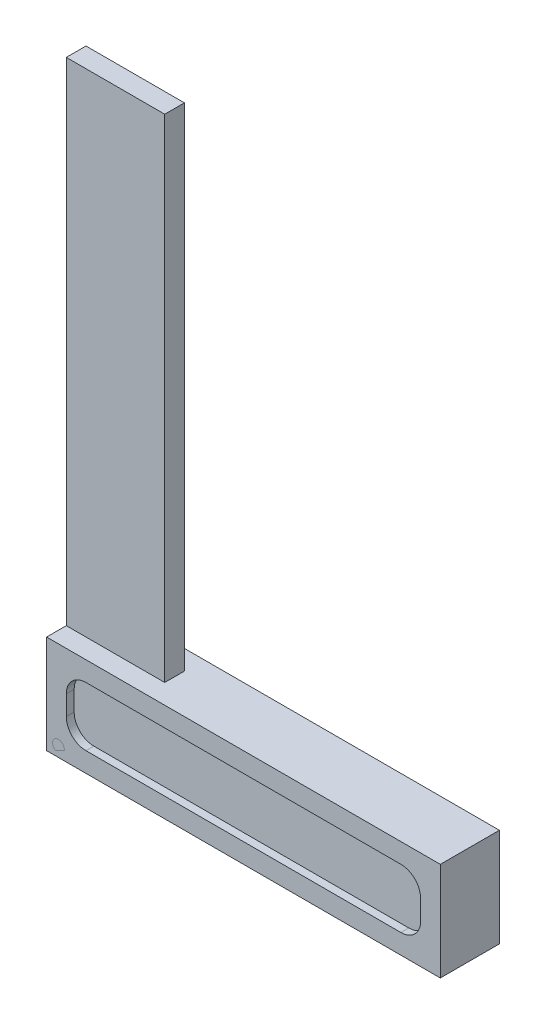
ISO-10303-21;
HEADER;
FILE_DESCRIPTION(('STEP AP214'),'2;1');
FILE_NAME('part.step','',(''),(''),'','','');
FILE_SCHEMA(('AUTOMOTIVE_DESIGN { 1 0 10303 214 1 1 1 1 }'));
ENDSEC;
DATA;
#1=APPLICATION_CONTEXT('core data for automotive mechanical design processes');
#2=APPLICATION_PROTOCOL_DEFINITION('international standard','automotive_design',2000,#1);
#3=PRODUCT_CONTEXT('',#1,'mechanical');
#4=PRODUCT('Part','Part','',(#3));
#5=PRODUCT_RELATED_PRODUCT_CATEGORY('part','',(#4));
#6=PRODUCT_DEFINITION_FORMATION('','',#4);
#7=PRODUCT_DEFINITION_CONTEXT('part definition',#1,'design');
#8=PRODUCT_DEFINITION('design','',#6,#7);
#9=PRODUCT_DEFINITION_SHAPE('','',#8);
#10=(LENGTH_UNIT() NAMED_UNIT(*) SI_UNIT(.MILLI.,.METRE.));
#11=(NAMED_UNIT(*) PLANE_ANGLE_UNIT() SI_UNIT($,.RADIAN.));
#12=(NAMED_UNIT(*) SI_UNIT($,.STERADIAN.) SOLID_ANGLE_UNIT());
#13=UNCERTAINTY_MEASURE_WITH_UNIT(LENGTH_MEASURE(1.E-05),#10,'distance_accuracy_value','');
#14=(GEOMETRIC_REPRESENTATION_CONTEXT(3) GLOBAL_UNCERTAINTY_ASSIGNED_CONTEXT((#13)) GLOBAL_UNIT_ASSIGNED_CONTEXT((#10,
#11,#12)) REPRESENTATION_CONTEXT('',''));
#15=CARTESIAN_POINT('',(0.,0.,0.));
#16=DIRECTION('',(0.,0.,1.));
#17=DIRECTION('',(1.,0.,0.));
#18=AXIS2_PLACEMENT_3D('',#15,#16,#17);
#19=CARTESIAN_POINT('',(3.,2.5,0.));
#20=DIRECTION('',(0.,0.,1.));
#21=DIRECTION('',(1.,0.,0.));
#22=AXIS2_PLACEMENT_3D('',#19,#20,#21);
#23=CYLINDRICAL_SURFACE('',#22,1.5);
#24=CARTESIAN_POINT('',(3.,2.5,0.));
#25=DIRECTION('',(0.,0.,1.));
#26=DIRECTION('',(1.,0.,0.));
#27=AXIS2_PLACEMENT_3D('',#24,#25,#26);
#28=CIRCLE('',#27,1.5);
#29=CARTESIAN_POINT('',(4.5,2.5,0.));
#30=VERTEX_POINT('',#29);
#31=EDGE_CURVE('E11',#30,#30,#28,.T.);
#32=ORIENTED_EDGE('',*,*,#31,.T.);
#33=EDGE_LOOP('',(#32));
#34=FACE_BOUND('',#33,.T.);
#35=CARTESIAN_POINT('',(3.,2.5,15.));
#36=DIRECTION('',(0.,0.,1.));
#37=DIRECTION('',(1.,0.,0.));
#38=AXIS2_PLACEMENT_3D('',#35,#36,#37);
#39=CIRCLE('',#38,1.5);
#40=CARTESIAN_POINT('',(4.5,2.5,15.));
#41=VERTEX_POINT('',#40);
#42=EDGE_CURVE('E43',#41,#41,#39,.T.);
#43=ORIENTED_EDGE('',*,*,#42,.F.);
#44=EDGE_LOOP('',(#43));
#45=FACE_BOUND('',#44,.T.);
#46=ADVANCED_FACE('F40',(#34,#45),#23,.T.);
#47=CARTESIAN_POINT('',(3.,2.5,0.));
#48=DIRECTION('',(0.,0.,1.));
#49=DIRECTION('',(1.,0.,0.));
#50=AXIS2_PLACEMENT_3D('',#47,#48,#49);
#51=PLANE('',#50);
#52=ORIENTED_EDGE('',*,*,#31,.F.);
#53=EDGE_LOOP('',(#52));
#54=FACE_BOUND('',#53,.T.);
#55=ADVANCED_FACE('F55',(#54),#51,.F.);
#56=CARTESIAN_POINT('',(3.,2.5,15.));
#57=DIRECTION('',(0.,0.,1.));
#58=DIRECTION('',(1.,0.,0.));
#59=AXIS2_PLACEMENT_3D('',#56,#57,#58);
#60=PLANE('',#59);
#61=ORIENTED_EDGE('',*,*,#42,.T.);
#62=EDGE_LOOP('',(#61));
#63=FACE_BOUND('',#62,.T.);
#64=ADVANCED_FACE('F52',(#63),#60,.T.);
#65=CLOSED_SHELL('',(#46,#55,#64));
#66=MANIFOLD_SOLID_BREP('B2',#65);
#67=CARTESIAN_POINT('',(22.5,22.5,0.));
#68=DIRECTION('',(0.,0.,1.));
#69=DIRECTION('',(1.,0.,0.));
#70=AXIS2_PLACEMENT_3D('',#67,#68,#69);
#71=CYLINDRICAL_SURFACE('',#70,1.5);
#72=CARTESIAN_POINT('',(22.5,22.5,0.));
#73=DIRECTION('',(0.,0.,1.));
#74=DIRECTION('',(1.,0.,0.));
#75=AXIS2_PLACEMENT_3D('',#72,#73,#74);
#76=CIRCLE('',#75,1.5);
#77=CARTESIAN_POINT('',(24.,22.5,0.));
#78=VERTEX_POINT('',#77);
#79=EDGE_CURVE('E39',#78,#78,#76,.T.);
#80=ORIENTED_EDGE('',*,*,#79,.T.);
#81=EDGE_LOOP('',(#80));
#82=FACE_BOUND('',#81,.T.);
#83=CARTESIAN_POINT('',(22.5,22.5,15.));
#84=DIRECTION('',(0.,0.,1.));
#85=DIRECTION('',(1.,0.,0.));
#86=AXIS2_PLACEMENT_3D('',#83,#84,#85);
#87=CIRCLE('',#86,1.5);
#88=CARTESIAN_POINT('',(24.,22.5,15.));
#89=VERTEX_POINT('',#88);
#90=EDGE_CURVE('E94',#89,#89,#87,.T.);
#91=ORIENTED_EDGE('',*,*,#90,.F.);
#92=EDGE_LOOP('',(#91));
#93=FACE_BOUND('',#92,.T.);
#94=ADVANCED_FACE('F91',(#82,#93),#71,.T.);
#95=CARTESIAN_POINT('',(22.5,22.5,0.));
#96=DIRECTION('',(0.,0.,1.));
#97=DIRECTION('',(1.,0.,0.));
#98=AXIS2_PLACEMENT_3D('',#95,#96,#97);
#99=PLANE('',#98);
#100=ORIENTED_EDGE('',*,*,#79,.F.);
#101=EDGE_LOOP('',(#100));
#102=FACE_BOUND('',#101,.T.);
#103=ADVANCED_FACE('F106',(#102),#99,.F.);
#104=CARTESIAN_POINT('',(22.5,22.5,15.));
#105=DIRECTION('',(0.,0.,1.));
#106=DIRECTION('',(1.,0.,0.));
#107=AXIS2_PLACEMENT_3D('',#104,#105,#106);
#108=PLANE('',#107);
#109=ORIENTED_EDGE('',*,*,#90,.T.);
#110=EDGE_LOOP('',(#109));
#111=FACE_BOUND('',#110,.T.);
#112=ADVANCED_FACE('F103',(#111),#108,.T.);
#113=CLOSED_SHELL('',(#94,#103,#112));
#114=MANIFOLD_SOLID_BREP('B6',#113);
#115=CARTESIAN_POINT('',(25.,25.,5.));
#116=DIRECTION('',(0.,0.,-1.));
#117=DIRECTION('',(-1.,0.,0.));
#118=AXIS2_PLACEMENT_3D('',#115,#116,#117);
#119=PLANE('',#118);
#120=DIRECTION('',(0.,-1.,0.));
#121=VECTOR('',#120,1.);
#122=CARTESIAN_POINT('',(0.,25.,5.));
#123=LINE('',#122,#121);
#124=CARTESIAN_POINT('',(0.,150.,5.));
#125=VERTEX_POINT('',#124);
#126=CARTESIAN_POINT('',(0.,0.,5.));
#127=VERTEX_POINT('',#126);
#128=EDGE_CURVE('E201',#125,#127,#123,.T.);
#129=ORIENTED_EDGE('',*,*,#128,.F.);
#130=DIRECTION('',(-1.,0.,0.));
#131=VECTOR('',#130,1.);
#132=CARTESIAN_POINT('',(25.,150.,5.));
#133=LINE('',#132,#131);
#134=CARTESIAN_POINT('',(25.,150.,5.));
#135=VERTEX_POINT('',#134);
#136=EDGE_CURVE('E89',#135,#125,#133,.T.);
#137=ORIENTED_EDGE('',*,*,#136,.F.);
#138=DIRECTION('',(0.,-1.,0.));
#139=VECTOR('',#138,1.);
#140=CARTESIAN_POINT('',(25.,0.,5.));
#141=LINE('',#140,#139);
#142=CARTESIAN_POINT('',(25.,0.,5.));
#143=VERTEX_POINT('',#142);
#144=EDGE_CURVE('E160',#135,#143,#141,.T.);
#145=ORIENTED_EDGE('',*,*,#144,.T.);
#146=DIRECTION('',(-1.,0.,0.));
#147=VECTOR('',#146,1.);
#148=CARTESIAN_POINT('',(25.,0.,5.));
#149=LINE('',#148,#147);
#150=EDGE_CURVE('E145',#143,#127,#149,.T.);
#151=ORIENTED_EDGE('',*,*,#150,.T.);
#152=EDGE_LOOP('',(#129,#137,#145,#151));
#153=FACE_BOUND('',#152,.T.);
#154=ADVANCED_FACE('F141',(#153),#119,.T.);
#155=CARTESIAN_POINT('',(25.,150.,5.));
#156=DIRECTION('',(0.,1.,0.));
#157=DIRECTION('',(0.,0.,1.));
#158=AXIS2_PLACEMENT_3D('',#155,#156,#157);
#159=PLANE('',#158);
#160=DIRECTION('',(0.,0.,-1.));
#161=VECTOR('',#160,1.);
#162=CARTESIAN_POINT('',(0.,150.,5.));
#163=LINE('',#162,#161);
#164=CARTESIAN_POINT('',(0.,150.,10.));
#165=VERTEX_POINT('',#164);
#166=EDGE_CURVE('E208',#165,#125,#163,.T.);
#167=ORIENTED_EDGE('',*,*,#166,.F.);
#168=DIRECTION('',(-1.,0.,0.));
#169=VECTOR('',#168,1.);
#170=CARTESIAN_POINT('',(25.,150.,10.));
#171=LINE('',#170,#169);
#172=CARTESIAN_POINT('',(25.,150.,10.));
#173=VERTEX_POINT('',#172);
#174=EDGE_CURVE('E151',#173,#165,#171,.T.);
#175=ORIENTED_EDGE('',*,*,#174,.F.);
#176=DIRECTION('',(0.,0.,-1.));
#177=VECTOR('',#176,1.);
#178=CARTESIAN_POINT('',(25.,150.,5.));
#179=LINE('',#178,#177);
#180=EDGE_CURVE('E198',#173,#135,#179,.T.);
#181=ORIENTED_EDGE('',*,*,#180,.T.);
#182=ORIENTED_EDGE('',*,*,#136,.T.);
#183=EDGE_LOOP('',(#167,#175,#181,#182));
#184=FACE_BOUND('',#183,.T.);
#185=ADVANCED_FACE('F215',(#184),#159,.T.);
#186=CARTESIAN_POINT('',(25.,150.,10.));
#187=DIRECTION('',(0.,0.,1.));
#188=DIRECTION('',(1.,0.,0.));
#189=AXIS2_PLACEMENT_3D('',#186,#187,#188);
#190=PLANE('',#189);
#191=DIRECTION('',(0.,1.,0.));
#192=VECTOR('',#191,1.);
#193=CARTESIAN_POINT('',(0.,150.,10.));
#194=LINE('',#193,#192);
#195=CARTESIAN_POINT('',(0.,0.,10.));
#196=VERTEX_POINT('',#195);
#197=EDGE_CURVE('E194',#196,#165,#194,.T.);
#198=ORIENTED_EDGE('',*,*,#197,.F.);
#199=DIRECTION('',(-1.,0.,0.));
#200=VECTOR('',#199,1.);
#201=CARTESIAN_POINT('',(25.,0.,10.));
#202=LINE('',#201,#200);
#203=CARTESIAN_POINT('',(25.,0.,10.));
#204=VERTEX_POINT('',#203);
#205=EDGE_CURVE('E189',#204,#196,#202,.T.);
#206=ORIENTED_EDGE('',*,*,#205,.F.);
#207=DIRECTION('',(0.,1.,0.));
#208=VECTOR('',#207,1.);
#209=CARTESIAN_POINT('',(25.,0.,10.));
#210=LINE('',#209,#208);
#211=EDGE_CURVE('E192',#204,#173,#210,.T.);
#212=ORIENTED_EDGE('',*,*,#211,.T.);
#213=ORIENTED_EDGE('',*,*,#174,.T.);
#214=EDGE_LOOP('',(#198,#206,#212,#213));
#215=FACE_BOUND('',#214,.T.);
#216=ADVANCED_FACE('F191',(#215),#190,.T.);
#217=CARTESIAN_POINT('',(25.,0.,5.));
#218=DIRECTION('',(0.,-1.,0.));
#219=DIRECTION('',(0.,0.,-1.));
#220=AXIS2_PLACEMENT_3D('',#217,#218,#219);
#221=PLANE('',#220);
#222=DIRECTION('',(0.,0.,1.));
#223=VECTOR('',#222,1.);
#224=CARTESIAN_POINT('',(0.,0.,5.));
#225=LINE('',#224,#223);
#226=EDGE_CURVE('E205',#127,#196,#225,.T.);
#227=ORIENTED_EDGE('',*,*,#226,.F.);
#228=ORIENTED_EDGE('',*,*,#150,.F.);
#229=DIRECTION('',(0.,0.,1.));
#230=VECTOR('',#229,1.);
#231=CARTESIAN_POINT('',(25.,0.,5.));
#232=LINE('',#231,#230);
#233=EDGE_CURVE('E197',#143,#204,#232,.T.);
#234=ORIENTED_EDGE('',*,*,#233,.T.);
#235=ORIENTED_EDGE('',*,*,#205,.T.);
#236=EDGE_LOOP('',(#227,#228,#234,#235));
#237=FACE_BOUND('',#236,.T.);
#238=ADVANCED_FACE('F143',(#237),#221,.T.);
#239=CARTESIAN_POINT('',(25.,0.,0.));
#240=DIRECTION('',(1.,0.,0.));
#241=DIRECTION('',(0.,0.,-1.));
#242=AXIS2_PLACEMENT_3D('',#239,#240,#241);
#243=PLANE('',#242);
#244=ORIENTED_EDGE('',*,*,#144,.F.);
#245=ORIENTED_EDGE('',*,*,#180,.F.);
#246=ORIENTED_EDGE('',*,*,#211,.F.);
#247=ORIENTED_EDGE('',*,*,#233,.F.);
#248=EDGE_LOOP('',(#244,#245,#246,#247));
#249=FACE_BOUND('',#248,.T.);
#250=ADVANCED_FACE('F196',(#249),#243,.T.);
#251=CARTESIAN_POINT('',(0.,0.,0.));
#252=DIRECTION('',(1.,0.,0.));
#253=DIRECTION('',(0.,0.,-1.));
#254=AXIS2_PLACEMENT_3D('',#251,#252,#253);
#255=PLANE('',#254);
#256=ORIENTED_EDGE('',*,*,#128,.T.);
#257=ORIENTED_EDGE('',*,*,#226,.T.);
#258=ORIENTED_EDGE('',*,*,#197,.T.);
#259=ORIENTED_EDGE('',*,*,#166,.T.);
#260=EDGE_LOOP('',(#256,#257,#258,#259));
#261=FACE_BOUND('',#260,.T.);
#262=ADVANCED_FACE('F213',(#261),#255,.F.);
#263=CLOSED_SHELL('',(#154,#185,#216,#238,#250,#262));
#264=MANIFOLD_SOLID_BREP('B34',#263);
#265=CARTESIAN_POINT('',(0.,0.,15.));
#266=DIRECTION('',(1.,0.,0.));
#267=DIRECTION('',(0.,0.,-1.));
#268=AXIS2_PLACEMENT_3D('',#265,#266,#267);
#269=PLANE('',#268);
#270=DIRECTION('',(0.,-1.,0.));
#271=VECTOR('',#270,1.);
#272=CARTESIAN_POINT('',(0.,0.,0.));
#273=LINE('',#272,#271);
#274=CARTESIAN_POINT('',(0.,25.,0.));
#275=VERTEX_POINT('',#274);
#276=CARTESIAN_POINT('',(0.,0.,0.));
#277=VERTEX_POINT('',#276);
#278=EDGE_CURVE('E382',#275,#277,#273,.T.);
#279=ORIENTED_EDGE('',*,*,#278,.T.);
#280=DIRECTION('',(0.,0.,-1.));
#281=VECTOR('',#280,1.);
#282=CARTESIAN_POINT('',(0.,0.,15.));
#283=LINE('',#282,#281);
#284=CARTESIAN_POINT('',(0.,0.,15.));
#285=VERTEX_POINT('',#284);
#286=EDGE_CURVE('E363',#285,#277,#283,.T.);
#287=ORIENTED_EDGE('',*,*,#286,.F.);
#288=DIRECTION('',(0.,-1.,0.));
#289=VECTOR('',#288,1.);
#290=CARTESIAN_POINT('',(0.,0.,15.));
#291=LINE('',#290,#289);
#292=CARTESIAN_POINT('',(0.,25.,15.));
#293=VERTEX_POINT('',#292);
#294=EDGE_CURVE('E370',#293,#285,#291,.T.);
#295=ORIENTED_EDGE('',*,*,#294,.F.);
#296=DIRECTION('',(0.,0.,-1.));
#297=VECTOR('',#296,1.);
#298=CARTESIAN_POINT('',(0.,25.,15.));
#299=LINE('',#298,#297);
#300=EDGE_CURVE('E460',#293,#275,#299,.T.);
#301=ORIENTED_EDGE('',*,*,#300,.T.);
#302=EDGE_LOOP('',(#279,#287,#295,#301));
#303=FACE_BOUND('',#302,.T.);
#304=ADVANCED_FACE('F271',(#303),#269,.F.);
#305=CARTESIAN_POINT('',(0.,0.,15.));
#306=DIRECTION('',(0.,1.,0.));
#307=DIRECTION('',(0.,0.,1.));
#308=AXIS2_PLACEMENT_3D('',#305,#306,#307);
#309=PLANE('',#308);
#310=DIRECTION('',(1.,0.,0.));
#311=VECTOR('',#310,1.);
#312=CARTESIAN_POINT('',(0.,0.,0.));
#313=LINE('',#312,#311);
#314=CARTESIAN_POINT('',(100.,0.,0.));
#315=VERTEX_POINT('',#314);
#316=EDGE_CURVE('E447',#277,#315,#313,.T.);
#317=ORIENTED_EDGE('',*,*,#316,.T.);
#318=DIRECTION('',(0.,0.,-1.));
#319=VECTOR('',#318,1.);
#320=CARTESIAN_POINT('',(100.,0.,15.));
#321=LINE('',#320,#319);
#322=CARTESIAN_POINT('',(100.,0.,15.));
#323=VERTEX_POINT('',#322);
#324=EDGE_CURVE('E366',#323,#315,#321,.T.);
#325=ORIENTED_EDGE('',*,*,#324,.F.);
#326=DIRECTION('',(1.,0.,0.));
#327=VECTOR('',#326,1.);
#328=CARTESIAN_POINT('',(0.,0.,15.));
#329=LINE('',#328,#327);
#330=EDGE_CURVE('E359',#285,#323,#329,.T.);
#331=ORIENTED_EDGE('',*,*,#330,.F.);
#332=ORIENTED_EDGE('',*,*,#286,.T.);
#333=EDGE_LOOP('',(#317,#325,#331,#332));
#334=FACE_BOUND('',#333,.T.);
#335=ADVANCED_FACE('F361',(#334),#309,.F.);
#336=CARTESIAN_POINT('',(100.,0.,15.));
#337=DIRECTION('',(-1.,0.,0.));
#338=DIRECTION('',(0.,0.,1.));
#339=AXIS2_PLACEMENT_3D('',#336,#337,#338);
#340=PLANE('',#339);
#341=DIRECTION('',(0.,1.,0.));
#342=VECTOR('',#341,1.);
#343=CARTESIAN_POINT('',(100.,0.,0.));
#344=LINE('',#343,#342);
#345=CARTESIAN_POINT('',(100.,25.,0.));
#346=VERTEX_POINT('',#345);
#347=EDGE_CURVE('E463',#315,#346,#344,.T.);
#348=ORIENTED_EDGE('',*,*,#347,.T.);
#349=DIRECTION('',(0.,0.,-1.));
#350=VECTOR('',#349,1.);
#351=CARTESIAN_POINT('',(100.,25.,15.));
#352=LINE('',#351,#350);
#353=CARTESIAN_POINT('',(100.,25.,15.));
#354=VERTEX_POINT('',#353);
#355=EDGE_CURVE('E387',#354,#346,#352,.T.);
#356=ORIENTED_EDGE('',*,*,#355,.F.);
#357=DIRECTION('',(0.,1.,0.));
#358=VECTOR('',#357,1.);
#359=CARTESIAN_POINT('',(100.,0.,15.));
#360=LINE('',#359,#358);
#361=EDGE_CURVE('E369',#323,#354,#360,.T.);
#362=ORIENTED_EDGE('',*,*,#361,.F.);
#363=ORIENTED_EDGE('',*,*,#324,.T.);
#364=EDGE_LOOP('',(#348,#356,#362,#363));
#365=FACE_BOUND('',#364,.T.);
#366=ADVANCED_FACE('F475',(#365),#340,.F.);
#367=CARTESIAN_POINT('',(0.,25.,15.));
#368=DIRECTION('',(0.,-1.,0.));
#369=DIRECTION('',(0.,0.,-1.));
#370=AXIS2_PLACEMENT_3D('',#367,#368,#369);
#371=PLANE('',#370);
#372=DIRECTION('',(-1.,0.,0.));
#373=VECTOR('',#372,1.);
#374=CARTESIAN_POINT('',(0.,25.,0.));
#375=LINE('',#374,#373);
#376=EDGE_CURVE('E379',#346,#275,#375,.T.);
#377=ORIENTED_EDGE('',*,*,#376,.T.);
#378=ORIENTED_EDGE('',*,*,#300,.F.);
#379=DIRECTION('',(-1.,0.,0.));
#380=VECTOR('',#379,1.);
#381=CARTESIAN_POINT('',(0.,25.,15.));
#382=LINE('',#381,#380);
#383=EDGE_CURVE('E375',#354,#293,#382,.T.);
#384=ORIENTED_EDGE('',*,*,#383,.F.);
#385=ORIENTED_EDGE('',*,*,#355,.T.);
#386=EDGE_LOOP('',(#377,#378,#384,#385));
#387=FACE_BOUND('',#386,.T.);
#388=ADVANCED_FACE('F470',(#387),#371,.F.);
#389=CARTESIAN_POINT('',(0.,0.,15.));
#390=DIRECTION('',(0.,0.,-1.));
#391=DIRECTION('',(-1.,0.,0.));
#392=AXIS2_PLACEMENT_3D('',#389,#390,#391);
#393=PLANE('',#392);
#394=DIRECTION('',(1.,0.,0.));
#395=VECTOR('',#394,1.);
#396=CARTESIAN_POINT('',(5.,5.,15.));
#397=LINE('',#396,#395);
#398=CARTESIAN_POINT('',(10.,5.,15.));
#399=VERTEX_POINT('',#398);
#400=CARTESIAN_POINT('',(90.,5.,15.));
#401=VERTEX_POINT('',#400);
#402=EDGE_CURVE('E432',#399,#401,#397,.T.);
#403=ORIENTED_EDGE('',*,*,#402,.F.);
#404=CARTESIAN_POINT('',(10.,10.,15.));
#405=DIRECTION('',(0.,0.,-1.));
#406=DIRECTION('',(-1.,0.,0.));
#407=AXIS2_PLACEMENT_3D('',#404,#405,#406);
#408=CIRCLE('',#407,5.);
#409=CARTESIAN_POINT('',(5.,10.,15.));
#410=VERTEX_POINT('',#409);
#411=EDGE_CURVE('E279',#399,#410,#408,.T.);
#412=ORIENTED_EDGE('',*,*,#411,.T.);
#413=DIRECTION('',(0.,-1.,0.));
#414=VECTOR('',#413,1.);
#415=CARTESIAN_POINT('',(5.,20.,15.));
#416=LINE('',#415,#414);
#417=CARTESIAN_POINT('',(5.,15.,15.));
#418=VERTEX_POINT('',#417);
#419=EDGE_CURVE('E453',#418,#410,#416,.T.);
#420=ORIENTED_EDGE('',*,*,#419,.F.);
#421=CARTESIAN_POINT('',(10.,15.,15.));
#422=DIRECTION('',(0.,0.,-1.));
#423=DIRECTION('',(-1.,0.,0.));
#424=AXIS2_PLACEMENT_3D('',#421,#422,#423);
#425=CIRCLE('',#424,5.);
#426=CARTESIAN_POINT('',(10.,20.,15.));
#427=VERTEX_POINT('',#426);
#428=EDGE_CURVE('E139',#418,#427,#425,.T.);
#429=ORIENTED_EDGE('',*,*,#428,.T.);
#430=DIRECTION('',(-1.,0.,0.));
#431=VECTOR('',#430,1.);
#432=CARTESIAN_POINT('',(5.,20.,15.));
#433=LINE('',#432,#431);
#434=CARTESIAN_POINT('',(90.,20.,15.));
#435=VERTEX_POINT('',#434);
#436=EDGE_CURVE('E423',#435,#427,#433,.T.);
#437=ORIENTED_EDGE('',*,*,#436,.F.);
#438=CARTESIAN_POINT('',(90.,15.,15.));
#439=DIRECTION('',(0.,0.,-1.));
#440=DIRECTION('',(-1.,0.,0.));
#441=AXIS2_PLACEMENT_3D('',#438,#439,#440);
#442=CIRCLE('',#441,5.);
#443=CARTESIAN_POINT('',(95.,15.,15.));
#444=VERTEX_POINT('',#443);
#445=EDGE_CURVE('E417',#435,#444,#442,.T.);
#446=ORIENTED_EDGE('',*,*,#445,.T.);
#447=DIRECTION('',(0.,1.,0.));
#448=VECTOR('',#447,1.);
#449=CARTESIAN_POINT('',(95.,20.,15.));
#450=LINE('',#449,#448);
#451=CARTESIAN_POINT('',(95.,10.,15.));
#452=VERTEX_POINT('',#451);
#453=EDGE_CURVE('E421',#452,#444,#450,.T.);
#454=ORIENTED_EDGE('',*,*,#453,.F.);
#455=CARTESIAN_POINT('',(90.,10.,15.));
#456=DIRECTION('',(0.,0.,-1.));
#457=DIRECTION('',(-1.,0.,0.));
#458=AXIS2_PLACEMENT_3D('',#455,#456,#457);
#459=CIRCLE('',#458,5.);
#460=EDGE_CURVE('E415',#452,#401,#459,.T.);
#461=ORIENTED_EDGE('',*,*,#460,.T.);
#462=EDGE_LOOP('',(#403,#412,#420,#429,#437,#446,#454,#461));
#463=FACE_BOUND('',#462,.T.);
#464=ORIENTED_EDGE('',*,*,#294,.T.);
#465=ORIENTED_EDGE('',*,*,#330,.T.);
#466=ORIENTED_EDGE('',*,*,#361,.T.);
#467=ORIENTED_EDGE('',*,*,#383,.T.);
#468=EDGE_LOOP('',(#464,#465,#466,#467));
#469=FACE_BOUND('',#468,.T.);
#470=ADVANCED_FACE('F373',(#463,#469),#393,.F.);
#471=CARTESIAN_POINT('',(0.,0.,0.));
#472=DIRECTION('',(0.,0.,-1.));
#473=DIRECTION('',(-1.,0.,0.));
#474=AXIS2_PLACEMENT_3D('',#471,#472,#473);
#475=PLANE('',#474);
#476=ORIENTED_EDGE('',*,*,#278,.F.);
#477=ORIENTED_EDGE('',*,*,#376,.F.);
#478=ORIENTED_EDGE('',*,*,#347,.F.);
#479=ORIENTED_EDGE('',*,*,#316,.F.);
#480=EDGE_LOOP('',(#476,#477,#478,#479));
#481=FACE_BOUND('',#480,.T.);
#482=ADVANCED_FACE('F474',(#481),#475,.T.);
#483=CARTESIAN_POINT('',(5.,20.,13.));
#484=DIRECTION('',(-1.,0.,0.));
#485=DIRECTION('',(0.,0.,1.));
#486=AXIS2_PLACEMENT_3D('',#483,#484,#485);
#487=PLANE('',#486);
#488=ORIENTED_EDGE('',*,*,#419,.T.);
#489=DIRECTION('',(0.,0.,1.));
#490=VECTOR('',#489,1.);
#491=CARTESIAN_POINT('',(5.,10.,13.));
#492=LINE('',#491,#490);
#493=CARTESIAN_POINT('',(5.,10.,13.));
#494=VERTEX_POINT('',#493);
#495=EDGE_CURVE('E413',#410,#494,#492,.F.);
#496=ORIENTED_EDGE('',*,*,#495,.T.);
#497=DIRECTION('',(0.,-1.,0.));
#498=VECTOR('',#497,1.);
#499=CARTESIAN_POINT('',(5.,20.,13.));
#500=LINE('',#499,#498);
#501=CARTESIAN_POINT('',(5.,15.,13.));
#502=VERTEX_POINT('',#501);
#503=EDGE_CURVE('E457',#502,#494,#500,.T.);
#504=ORIENTED_EDGE('',*,*,#503,.F.);
#505=DIRECTION('',(0.,0.,1.));
#506=VECTOR('',#505,1.);
#507=CARTESIAN_POINT('',(5.,15.,15.));
#508=LINE('',#507,#506);
#509=EDGE_CURVE('E411',#502,#418,#508,.T.);
#510=ORIENTED_EDGE('',*,*,#509,.T.);
#511=EDGE_LOOP('',(#488,#496,#504,#510));
#512=FACE_BOUND('',#511,.T.);
#513=ADVANCED_FACE('F521',(#512),#487,.F.);
#514=CARTESIAN_POINT('',(5.,20.,13.));
#515=DIRECTION('',(0.,1.,0.));
#516=DIRECTION('',(0.,0.,1.));
#517=AXIS2_PLACEMENT_3D('',#514,#515,#516);
#518=PLANE('',#517);
#519=DIRECTION('',(-1.,0.,0.));
#520=VECTOR('',#519,1.);
#521=CARTESIAN_POINT('',(5.,20.,13.));
#522=LINE('',#521,#520);
#523=CARTESIAN_POINT('',(90.,20.,13.));
#524=VERTEX_POINT('',#523);
#525=CARTESIAN_POINT('',(10.,20.,13.));
#526=VERTEX_POINT('',#525);
#527=EDGE_CURVE('E441',#524,#526,#522,.T.);
#528=ORIENTED_EDGE('',*,*,#527,.F.);
#529=DIRECTION('',(0.,0.,1.));
#530=VECTOR('',#529,1.);
#531=CARTESIAN_POINT('',(90.,20.,15.));
#532=LINE('',#531,#530);
#533=EDGE_CURVE('E408',#524,#435,#532,.T.);
#534=ORIENTED_EDGE('',*,*,#533,.T.);
#535=ORIENTED_EDGE('',*,*,#436,.T.);
#536=DIRECTION('',(0.,0.,1.));
#537=VECTOR('',#536,1.);
#538=CARTESIAN_POINT('',(10.,20.,13.));
#539=LINE('',#538,#537);
#540=EDGE_CURVE('E406',#427,#526,#539,.F.);
#541=ORIENTED_EDGE('',*,*,#540,.T.);
#542=EDGE_LOOP('',(#528,#534,#535,#541));
#543=FACE_BOUND('',#542,.T.);
#544=ADVANCED_FACE('F445',(#543),#518,.F.);
#545=CARTESIAN_POINT('',(95.,20.,13.));
#546=DIRECTION('',(1.,0.,0.));
#547=DIRECTION('',(0.,0.,-1.));
#548=AXIS2_PLACEMENT_3D('',#545,#546,#547);
#549=PLANE('',#548);
#550=DIRECTION('',(0.,1.,0.));
#551=VECTOR('',#550,1.);
#552=CARTESIAN_POINT('',(95.,20.,13.));
#553=LINE('',#552,#551);
#554=CARTESIAN_POINT('',(95.,10.,13.));
#555=VERTEX_POINT('',#554);
#556=CARTESIAN_POINT('',(95.,15.,13.));
#557=VERTEX_POINT('',#556);
#558=EDGE_CURVE('E443',#555,#557,#553,.T.);
#559=ORIENTED_EDGE('',*,*,#558,.F.);
#560=DIRECTION('',(0.,0.,1.));
#561=VECTOR('',#560,1.);
#562=CARTESIAN_POINT('',(95.,10.,15.));
#563=LINE('',#562,#561);
#564=EDGE_CURVE('E385',#555,#452,#563,.T.);
#565=ORIENTED_EDGE('',*,*,#564,.T.);
#566=ORIENTED_EDGE('',*,*,#453,.T.);
#567=DIRECTION('',(0.,0.,1.));
#568=VECTOR('',#567,1.);
#569=CARTESIAN_POINT('',(95.,15.,13.));
#570=LINE('',#569,#568);
#571=EDGE_CURVE('E383',#444,#557,#570,.F.);
#572=ORIENTED_EDGE('',*,*,#571,.T.);
#573=EDGE_LOOP('',(#559,#565,#566,#572));
#574=FACE_BOUND('',#573,.T.);
#575=ADVANCED_FACE('F429',(#574),#549,.F.);
#576=CARTESIAN_POINT('',(5.,5.,13.));
#577=DIRECTION('',(0.,-1.,0.));
#578=DIRECTION('',(0.,0.,-1.));
#579=AXIS2_PLACEMENT_3D('',#576,#577,#578);
#580=PLANE('',#579);
#581=ORIENTED_EDGE('',*,*,#402,.T.);
#582=DIRECTION('',(0.,0.,1.));
#583=VECTOR('',#582,1.);
#584=CARTESIAN_POINT('',(90.,5.,13.));
#585=LINE('',#584,#583);
#586=CARTESIAN_POINT('',(90.,5.,13.));
#587=VERTEX_POINT('',#586);
#588=EDGE_CURVE('E396',#401,#587,#585,.F.);
#589=ORIENTED_EDGE('',*,*,#588,.T.);
#590=DIRECTION('',(1.,0.,0.));
#591=VECTOR('',#590,1.);
#592=CARTESIAN_POINT('',(5.,5.,13.));
#593=LINE('',#592,#591);
#594=CARTESIAN_POINT('',(10.,5.,13.));
#595=VERTEX_POINT('',#594);
#596=EDGE_CURVE('E449',#595,#587,#593,.T.);
#597=ORIENTED_EDGE('',*,*,#596,.F.);
#598=DIRECTION('',(0.,0.,1.));
#599=VECTOR('',#598,1.);
#600=CARTESIAN_POINT('',(10.,5.,15.));
#601=LINE('',#600,#599);
#602=EDGE_CURVE('E393',#595,#399,#601,.T.);
#603=ORIENTED_EDGE('',*,*,#602,.T.);
#604=EDGE_LOOP('',(#581,#589,#597,#603));
#605=FACE_BOUND('',#604,.T.);
#606=ADVANCED_FACE('F508',(#605),#580,.F.);
#607=CARTESIAN_POINT('',(0.,0.,13.));
#608=DIRECTION('',(0.,0.,1.));
#609=DIRECTION('',(1.,0.,0.));
#610=AXIS2_PLACEMENT_3D('',#607,#608,#609);
#611=PLANE('',#610);
#612=ORIENTED_EDGE('',*,*,#596,.T.);
#613=CARTESIAN_POINT('',(90.,10.,13.));
#614=DIRECTION('',(0.,0.,1.));
#615=DIRECTION('',(1.,0.,0.));
#616=AXIS2_PLACEMENT_3D('',#613,#614,#615);
#617=CIRCLE('',#616,5.);
#618=EDGE_CURVE('E404',#587,#555,#617,.T.);
#619=ORIENTED_EDGE('',*,*,#618,.T.);
#620=ORIENTED_EDGE('',*,*,#558,.T.);
#621=CARTESIAN_POINT('',(90.,15.,13.));
#622=DIRECTION('',(0.,0.,1.));
#623=DIRECTION('',(1.,0.,0.));
#624=AXIS2_PLACEMENT_3D('',#621,#622,#623);
#625=CIRCLE('',#624,5.);
#626=EDGE_CURVE('E402',#557,#524,#625,.T.);
#627=ORIENTED_EDGE('',*,*,#626,.T.);
#628=ORIENTED_EDGE('',*,*,#527,.T.);
#629=CARTESIAN_POINT('',(10.,15.,13.));
#630=DIRECTION('',(0.,0.,1.));
#631=DIRECTION('',(1.,0.,0.));
#632=AXIS2_PLACEMENT_3D('',#629,#630,#631);
#633=CIRCLE('',#632,5.);
#634=EDGE_CURVE('E398',#526,#502,#633,.T.);
#635=ORIENTED_EDGE('',*,*,#634,.T.);
#636=ORIENTED_EDGE('',*,*,#503,.T.);
#637=CARTESIAN_POINT('',(10.,10.,13.));
#638=DIRECTION('',(0.,0.,1.));
#639=DIRECTION('',(1.,0.,0.));
#640=AXIS2_PLACEMENT_3D('',#637,#638,#639);
#641=CIRCLE('',#640,5.);
#642=EDGE_CURVE('E400',#494,#595,#641,.T.);
#643=ORIENTED_EDGE('',*,*,#642,.T.);
#644=EDGE_LOOP('',(#612,#619,#620,#627,#628,#635,#636,#643));
#645=FACE_BOUND('',#644,.T.);
#646=ADVANCED_FACE('F440',(#645),#611,.T.);
#647=CARTESIAN_POINT('',(90.,10.,13.));
#648=DIRECTION('',(0.,0.,-1.));
#649=DIRECTION('',(-1.,0.,0.));
#650=AXIS2_PLACEMENT_3D('',#647,#648,#649);
#651=CYLINDRICAL_SURFACE('',#650,5.);
#652=ORIENTED_EDGE('',*,*,#618,.F.);
#653=ORIENTED_EDGE('',*,*,#588,.F.);
#654=ORIENTED_EDGE('',*,*,#460,.F.);
#655=ORIENTED_EDGE('',*,*,#564,.F.);
#656=EDGE_LOOP('',(#652,#653,#654,#655));
#657=FACE_BOUND('',#656,.T.);
#658=ADVANCED_FACE('F489',(#657),#651,.F.);
#659=CARTESIAN_POINT('',(90.,15.,13.));
#660=DIRECTION('',(0.,0.,-1.));
#661=DIRECTION('',(-1.,0.,0.));
#662=AXIS2_PLACEMENT_3D('',#659,#660,#661);
#663=CYLINDRICAL_SURFACE('',#662,5.);
#664=ORIENTED_EDGE('',*,*,#626,.F.);
#665=ORIENTED_EDGE('',*,*,#571,.F.);
#666=ORIENTED_EDGE('',*,*,#445,.F.);
#667=ORIENTED_EDGE('',*,*,#533,.F.);
#668=EDGE_LOOP('',(#664,#665,#666,#667));
#669=FACE_BOUND('',#668,.T.);
#670=ADVANCED_FACE('F435',(#669),#663,.F.);
#671=CARTESIAN_POINT('',(10.,10.,13.));
#672=DIRECTION('',(0.,0.,-1.));
#673=DIRECTION('',(-1.,0.,0.));
#674=AXIS2_PLACEMENT_3D('',#671,#672,#673);
#675=CYLINDRICAL_SURFACE('',#674,5.);
#676=ORIENTED_EDGE('',*,*,#642,.F.);
#677=ORIENTED_EDGE('',*,*,#495,.F.);
#678=ORIENTED_EDGE('',*,*,#411,.F.);
#679=ORIENTED_EDGE('',*,*,#602,.F.);
#680=EDGE_LOOP('',(#676,#677,#678,#679));
#681=FACE_BOUND('',#680,.T.);
#682=ADVANCED_FACE('F494',(#681),#675,.F.);
#683=CARTESIAN_POINT('',(10.,15.,13.));
#684=DIRECTION('',(0.,0.,-1.));
#685=DIRECTION('',(-1.,0.,0.));
#686=AXIS2_PLACEMENT_3D('',#683,#684,#685);
#687=CYLINDRICAL_SURFACE('',#686,5.);
#688=ORIENTED_EDGE('',*,*,#634,.F.);
#689=ORIENTED_EDGE('',*,*,#540,.F.);
#690=ORIENTED_EDGE('',*,*,#428,.F.);
#691=ORIENTED_EDGE('',*,*,#509,.F.);
#692=EDGE_LOOP('',(#688,#689,#690,#691));
#693=FACE_BOUND('',#692,.T.);
#694=ADVANCED_FACE('F273',(#693),#687,.F.);
#695=CLOSED_SHELL('',(#304,#335,#366,#388,#470,#482,#513,#544,#575,#606,#646,#658,#670,#682,#694));
#696=MANIFOLD_SOLID_BREP('B83',#695);
#697=ADVANCED_BREP_SHAPE_REPRESENTATION('',(#18,#66,#114,#264,#696),#14);
#698=SHAPE_DEFINITION_REPRESENTATION(#9,#697);
ENDSEC;
END-ISO-10303-21;
